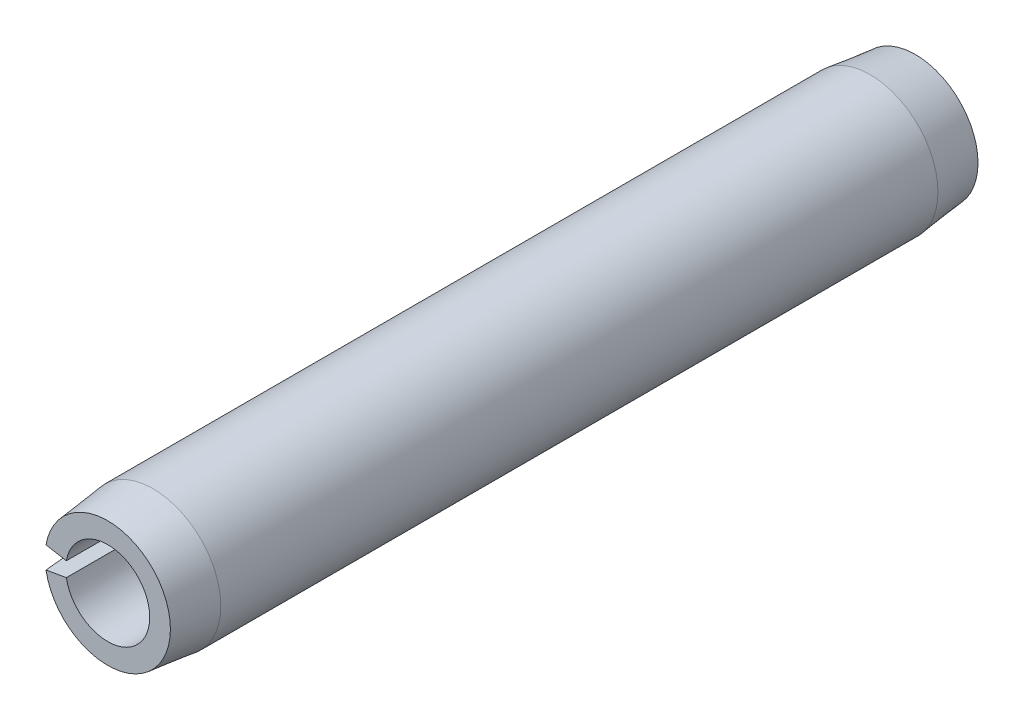
ISO-10303-21;
HEADER;
FILE_DESCRIPTION(('STEP AP214'),'2;1');
FILE_NAME('part.step','',(''),(''),'','','');
FILE_SCHEMA(('AUTOMOTIVE_DESIGN { 1 0 10303 214 1 1 1 1 }'));
ENDSEC;
DATA;
#1=APPLICATION_CONTEXT('core data for automotive mechanical design processes');
#2=APPLICATION_PROTOCOL_DEFINITION('international standard','automotive_design',2000,#1);
#3=PRODUCT_CONTEXT('',#1,'mechanical');
#4=PRODUCT('Part','Part','',(#3));
#5=PRODUCT_RELATED_PRODUCT_CATEGORY('part','',(#4));
#6=PRODUCT_DEFINITION_FORMATION('','',#4);
#7=PRODUCT_DEFINITION_CONTEXT('part definition',#1,'design');
#8=PRODUCT_DEFINITION('design','',#6,#7);
#9=PRODUCT_DEFINITION_SHAPE('','',#8);
#10=(LENGTH_UNIT() NAMED_UNIT(*) SI_UNIT(.MILLI.,.METRE.));
#11=(NAMED_UNIT(*) PLANE_ANGLE_UNIT() SI_UNIT($,.RADIAN.));
#12=(NAMED_UNIT(*) SI_UNIT($,.STERADIAN.) SOLID_ANGLE_UNIT());
#13=UNCERTAINTY_MEASURE_WITH_UNIT(LENGTH_MEASURE(1.E-05),#10,'distance_accuracy_value','');
#14=(GEOMETRIC_REPRESENTATION_CONTEXT(3) GLOBAL_UNCERTAINTY_ASSIGNED_CONTEXT((#13)) GLOBAL_UNIT_ASSIGNED_CONTEXT((#10,
#11,#12)) REPRESENTATION_CONTEXT('',''));
#15=CARTESIAN_POINT('',(0.,0.,0.));
#16=DIRECTION('',(0.,0.,1.));
#17=DIRECTION('',(1.,0.,0.));
#18=AXIS2_PLACEMENT_3D('',#15,#16,#17);
#19=CARTESIAN_POINT('',(0.,0.,4.7625));
#20=DIRECTION('',(0.,0.,1.));
#21=DIRECTION('',(1.,0.,0.));
#22=AXIS2_PLACEMENT_3D('',#19,#20,#21);
#23=PLANE('',#22);
#24=CARTESIAN_POINT('',(0.,0.,4.7625));
#25=DIRECTION('',(0.,0.,-1.));
#26=DIRECTION('',(-1.,0.,0.));
#27=AXIS2_PLACEMENT_3D('',#24,#25,#26);
#28=CIRCLE('',#27,0.739140000000003);
#29=CARTESIAN_POINT('',(-0.727910802561447,0.128350314040733,4.7625));
#30=VERTEX_POINT('',#29);
#31=CARTESIAN_POINT('',(-0.727910802561448,-0.128350314040733,4.7625));
#32=VERTEX_POINT('',#31);
#33=EDGE_CURVE('E122',#30,#32,#28,.T.);
#34=ORIENTED_EDGE('',*,*,#33,.F.);
#35=DIRECTION('',(0.984807753012209,-0.173648177666927,0.));
#36=VECTOR('',#35,1.);
#37=CARTESIAN_POINT('',(-0.787944683185068,0.138935906951308,4.7625));
#38=LINE('',#37,#36);
#39=CARTESIAN_POINT('',(-0.487775280066947,0.0860079423984288,4.7625));
#40=VERTEX_POINT('',#39);
#41=EDGE_CURVE('E145',#30,#40,#38,.T.);
#42=ORIENTED_EDGE('',*,*,#41,.T.);
#43=CARTESIAN_POINT('',(0.,0.,4.7625));
#44=DIRECTION('',(0.,0.,-1.));
#45=DIRECTION('',(1.,0.,0.));
#46=AXIS2_PLACEMENT_3D('',#43,#44,#45);
#47=CIRCLE('',#46,0.4953);
#48=CARTESIAN_POINT('',(-0.487775280066947,-0.0860079423984287,4.7625));
#49=VERTEX_POINT('',#48);
#50=EDGE_CURVE('E142',#40,#49,#47,.T.);
#51=ORIENTED_EDGE('',*,*,#50,.T.);
#52=DIRECTION('',(-0.984807753012209,-0.173648177666928,0.));
#53=VECTOR('',#52,1.);
#54=CARTESIAN_POINT('',(-0.487775280066947,-0.0860079423984287,4.7625));
#55=LINE('',#54,#53);
#56=EDGE_CURVE('E131',#49,#32,#55,.T.);
#57=ORIENTED_EDGE('',*,*,#56,.T.);
#58=EDGE_LOOP('',(#34,#42,#51,#57));
#59=FACE_BOUND('',#58,.T.);
#60=ADVANCED_FACE('F69',(#59),#23,.T.);
#61=CARTESIAN_POINT('',(0.,0.,-4.7625));
#62=DIRECTION('',(0.,0.,1.));
#63=DIRECTION('',(1.,0.,0.));
#64=AXIS2_PLACEMENT_3D('',#61,#62,#63);
#65=CYLINDRICAL_SURFACE('',#64,0.4953);
#66=DIRECTION('',(0.,0.,1.));
#67=VECTOR('',#66,1.);
#68=CARTESIAN_POINT('',(-0.487775280066947,-0.0860079423984287,-4.7625));
#69=LINE('',#68,#67);
#70=CARTESIAN_POINT('',(-0.487775280066947,-0.0860079423984287,-4.7625));
#71=VERTEX_POINT('',#70);
#72=EDGE_CURVE('E73',#71,#49,#69,.T.);
#73=ORIENTED_EDGE('',*,*,#72,.T.);
#74=ORIENTED_EDGE('',*,*,#50,.F.);
#75=DIRECTION('',(0.,0.,1.));
#76=VECTOR('',#75,1.);
#77=CARTESIAN_POINT('',(-0.487775280066947,0.0860079423984288,-4.7625));
#78=LINE('',#77,#76);
#79=CARTESIAN_POINT('',(-0.487775280066947,0.0860079423984288,-4.7625));
#80=VERTEX_POINT('',#79);
#81=EDGE_CURVE('E12',#80,#40,#78,.T.);
#82=ORIENTED_EDGE('',*,*,#81,.F.);
#83=CARTESIAN_POINT('',(0.,0.,-4.7625));
#84=DIRECTION('',(0.,0.,-1.));
#85=DIRECTION('',(1.,0.,0.));
#86=AXIS2_PLACEMENT_3D('',#83,#84,#85);
#87=CIRCLE('',#86,0.4953);
#88=EDGE_CURVE('E144',#80,#71,#87,.T.);
#89=ORIENTED_EDGE('',*,*,#88,.T.);
#90=EDGE_LOOP('',(#73,#74,#82,#89));
#91=FACE_BOUND('',#90,.T.);
#92=ADVANCED_FACE('F71',(#91),#65,.F.);
#93=CARTESIAN_POINT('',(-0.787944683185068,0.138935906951308,-4.7625));
#94=DIRECTION('',(-0.173648177666927,-0.984807753012209,0.));
#95=DIRECTION('',(0.984807753012209,-0.173648177666927,0.));
#96=AXIS2_PLACEMENT_3D('',#93,#94,#95);
#97=PLANE('',#96);
#98=DIRECTION('',(-0.111821563303197,0.0197171586353527,-0.993532672656404));
#99=VECTOR('',#98,1.);
#100=CARTESIAN_POINT('',(0.,0.,11.229975));
#101=LINE('',#100,#99);
#102=CARTESIAN_POINT('',(-0.787944683185071,0.138935906951309,4.2291));
#103=VERTEX_POINT('',#102);
#104=EDGE_CURVE('E88',#103,#30,#101,.F.);
#105=ORIENTED_EDGE('',*,*,#104,.F.);
#106=DIRECTION('',(0.,0.,1.));
#107=VECTOR('',#106,1.);
#108=CARTESIAN_POINT('',(-0.787944683185068,0.138935906951308,-4.7625));
#109=LINE('',#108,#107);
#110=CARTESIAN_POINT('',(-0.787944683185071,0.138935906951309,-4.2291));
#111=VERTEX_POINT('',#110);
#112=EDGE_CURVE('E76',#111,#103,#109,.T.);
#113=ORIENTED_EDGE('',*,*,#112,.F.);
#114=DIRECTION('',(0.111821563303197,-0.0197171586353527,-0.993532672656404));
#115=VECTOR('',#114,1.);
#116=CARTESIAN_POINT('',(0.,0.,-11.229975));
#117=LINE('',#116,#115);
#118=CARTESIAN_POINT('',(-0.727910802561447,0.128350314040733,-4.7625));
#119=VERTEX_POINT('',#118);
#120=EDGE_CURVE('E148',#119,#111,#117,.F.);
#121=ORIENTED_EDGE('',*,*,#120,.F.);
#122=DIRECTION('',(0.984807753012209,-0.173648177666927,0.));
#123=VECTOR('',#122,1.);
#124=CARTESIAN_POINT('',(-0.787944683185068,0.138935906951308,-4.7625));
#125=LINE('',#124,#123);
#126=EDGE_CURVE('E154',#119,#80,#125,.T.);
#127=ORIENTED_EDGE('',*,*,#126,.T.);
#128=ORIENTED_EDGE('',*,*,#81,.T.);
#129=ORIENTED_EDGE('',*,*,#41,.F.);
#130=EDGE_LOOP('',(#105,#113,#121,#127,#128,#129));
#131=FACE_BOUND('',#130,.T.);
#132=ADVANCED_FACE('F178',(#131),#97,.T.);
#133=CARTESIAN_POINT('',(0.,0.,-4.7625));
#134=DIRECTION('',(0.,0.,1.));
#135=DIRECTION('',(1.,0.,0.));
#136=AXIS2_PLACEMENT_3D('',#133,#134,#135);
#137=CYLINDRICAL_SURFACE('',#136,0.8001);
#138=CARTESIAN_POINT('',(0.,0.,4.2291));
#139=DIRECTION('',(0.,0.,-1.));
#140=DIRECTION('',(-1.,0.,0.));
#141=AXIS2_PLACEMENT_3D('',#138,#139,#140);
#142=CIRCLE('',#141,0.800100000000004);
#143=CARTESIAN_POINT('',(-0.787944683185072,-0.138935906951309,4.2291));
#144=VERTEX_POINT('',#143);
#145=EDGE_CURVE('E127',#103,#144,#142,.T.);
#146=ORIENTED_EDGE('',*,*,#145,.T.);
#147=DIRECTION('',(0.,0.,1.));
#148=VECTOR('',#147,1.);
#149=CARTESIAN_POINT('',(-0.787944683185068,-0.138935906951308,-4.7625));
#150=LINE('',#149,#148);
#151=CARTESIAN_POINT('',(-0.787944683185072,-0.138935906951309,-4.2291));
#152=VERTEX_POINT('',#151);
#153=EDGE_CURVE('E138',#152,#144,#150,.T.);
#154=ORIENTED_EDGE('',*,*,#153,.F.);
#155=CARTESIAN_POINT('',(0.,0.,-4.2291));
#156=DIRECTION('',(0.,0.,-1.));
#157=DIRECTION('',(-1.,0.,0.));
#158=AXIS2_PLACEMENT_3D('',#155,#156,#157);
#159=CIRCLE('',#158,0.800100000000004);
#160=EDGE_CURVE('E170',#111,#152,#159,.T.);
#161=ORIENTED_EDGE('',*,*,#160,.F.);
#162=ORIENTED_EDGE('',*,*,#112,.T.);
#163=EDGE_LOOP('',(#146,#154,#161,#162));
#164=FACE_BOUND('',#163,.T.);
#165=ADVANCED_FACE('F180',(#164),#137,.T.);
#166=CARTESIAN_POINT('',(-0.487775280066947,-0.0860079423984287,-4.7625));
#167=DIRECTION('',(-0.173648177666928,0.984807753012208,0.));
#168=DIRECTION('',(-0.984807753012209,-0.173648177666928,0.));
#169=AXIS2_PLACEMENT_3D('',#166,#167,#168);
#170=PLANE('',#169);
#171=DIRECTION('',(0.111821563303197,0.0197171586353528,0.993532672656404));
#172=VECTOR('',#171,1.);
#173=CARTESIAN_POINT('',(0.,0.,11.229975));
#174=LINE('',#173,#172);
#175=EDGE_CURVE('E121',#32,#144,#174,.F.);
#176=ORIENTED_EDGE('',*,*,#175,.F.);
#177=ORIENTED_EDGE('',*,*,#56,.F.);
#178=ORIENTED_EDGE('',*,*,#72,.F.);
#179=DIRECTION('',(-0.984807753012209,-0.173648177666928,0.));
#180=VECTOR('',#179,1.);
#181=CARTESIAN_POINT('',(-0.487775280066947,-0.0860079423984287,-4.7625));
#182=LINE('',#181,#180);
#183=CARTESIAN_POINT('',(-0.727910802561448,-0.128350314040733,-4.7625));
#184=VERTEX_POINT('',#183);
#185=EDGE_CURVE('E155',#71,#184,#182,.T.);
#186=ORIENTED_EDGE('',*,*,#185,.T.);
#187=DIRECTION('',(-0.111821563303197,-0.0197171586353528,0.993532672656404));
#188=VECTOR('',#187,1.);
#189=CARTESIAN_POINT('',(0.,0.,-11.229975));
#190=LINE('',#189,#188);
#191=EDGE_CURVE('E92',#152,#184,#190,.F.);
#192=ORIENTED_EDGE('',*,*,#191,.F.);
#193=ORIENTED_EDGE('',*,*,#153,.T.);
#194=EDGE_LOOP('',(#176,#177,#178,#186,#192,#193));
#195=FACE_BOUND('',#194,.T.);
#196=ADVANCED_FACE('F134',(#195),#170,.T.);
#197=CARTESIAN_POINT('',(0.,0.,-4.7625));
#198=DIRECTION('',(0.,0.,1.));
#199=DIRECTION('',(1.,0.,0.));
#200=AXIS2_PLACEMENT_3D('',#197,#198,#199);
#201=PLANE('',#200);
#202=ORIENTED_EDGE('',*,*,#126,.F.);
#203=CARTESIAN_POINT('',(0.,0.,-4.7625));
#204=DIRECTION('',(0.,0.,-1.));
#205=DIRECTION('',(-1.,0.,0.));
#206=AXIS2_PLACEMENT_3D('',#203,#204,#205);
#207=CIRCLE('',#206,0.739140000000003);
#208=EDGE_CURVE('E164',#119,#184,#207,.T.);
#209=ORIENTED_EDGE('',*,*,#208,.T.);
#210=ORIENTED_EDGE('',*,*,#185,.F.);
#211=ORIENTED_EDGE('',*,*,#88,.F.);
#212=EDGE_LOOP('',(#202,#209,#210,#211));
#213=FACE_BOUND('',#212,.T.);
#214=ADVANCED_FACE('F165',(#213),#201,.F.);
#215=CARTESIAN_POINT('',(0.,0.,-4.2291));
#216=DIRECTION('',(0.,0.,1.));
#217=DIRECTION('',(1.,0.,0.));
#218=AXIS2_PLACEMENT_3D('',#215,#216,#217);
#219=CONICAL_SURFACE('',#218,0.800100000000004,0.113792007143708);
#220=ORIENTED_EDGE('',*,*,#120,.T.);
#221=ORIENTED_EDGE('',*,*,#160,.T.);
#222=ORIENTED_EDGE('',*,*,#191,.T.);
#223=ORIENTED_EDGE('',*,*,#208,.F.);
#224=EDGE_LOOP('',(#220,#221,#222,#223));
#225=FACE_BOUND('',#224,.T.);
#226=ADVANCED_FACE('F173',(#225),#219,.T.);
#227=CARTESIAN_POINT('',(0.,0.,4.2291));
#228=DIRECTION('',(0.,0.,-1.));
#229=DIRECTION('',(1.,0.,0.));
#230=AXIS2_PLACEMENT_3D('',#227,#228,#229);
#231=CONICAL_SURFACE('',#230,0.800100000000004,0.113792007143708);
#232=ORIENTED_EDGE('',*,*,#104,.T.);
#233=ORIENTED_EDGE('',*,*,#33,.T.);
#234=ORIENTED_EDGE('',*,*,#175,.T.);
#235=ORIENTED_EDGE('',*,*,#145,.F.);
#236=EDGE_LOOP('',(#232,#233,#234,#235));
#237=FACE_BOUND('',#236,.T.);
#238=ADVANCED_FACE('F124',(#237),#231,.T.);
#239=CLOSED_SHELL('',(#60,#92,#132,#165,#196,#214,#226,#238));
#240=MANIFOLD_SOLID_BREP('B2',#239);
#241=ADVANCED_BREP_SHAPE_REPRESENTATION('',(#18,#240),#14);
#242=SHAPE_DEFINITION_REPRESENTATION(#9,#241);
ENDSEC;
END-ISO-10303-21;
